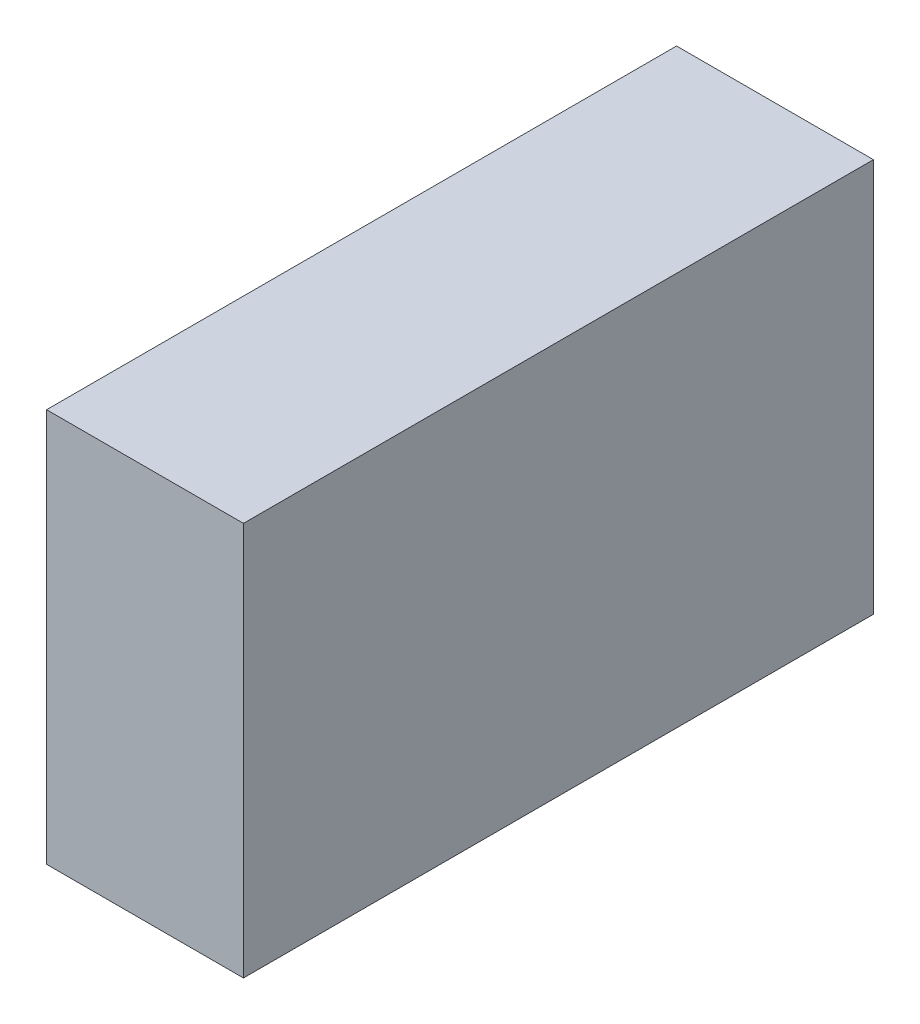
ISO-10303-21;
HEADER;
FILE_DESCRIPTION(('STEP AP214'),'2;1');
FILE_NAME('part.step','',(''),(''),'','','');
FILE_SCHEMA(('AUTOMOTIVE_DESIGN { 1 0 10303 214 1 1 1 1 }'));
ENDSEC;
DATA;
#1=APPLICATION_CONTEXT('core data for automotive mechanical design processes');
#2=APPLICATION_PROTOCOL_DEFINITION('international standard','automotive_design',2000,#1);
#3=PRODUCT_CONTEXT('',#1,'mechanical');
#4=PRODUCT('Part','Part','',(#3));
#5=PRODUCT_RELATED_PRODUCT_CATEGORY('part','',(#4));
#6=PRODUCT_DEFINITION_FORMATION('','',#4);
#7=PRODUCT_DEFINITION_CONTEXT('part definition',#1,'design');
#8=PRODUCT_DEFINITION('design','',#6,#7);
#9=PRODUCT_DEFINITION_SHAPE('','',#8);
#10=(LENGTH_UNIT() NAMED_UNIT(*) SI_UNIT(.MILLI.,.METRE.));
#11=(NAMED_UNIT(*) PLANE_ANGLE_UNIT() SI_UNIT($,.RADIAN.));
#12=(NAMED_UNIT(*) SI_UNIT($,.STERADIAN.) SOLID_ANGLE_UNIT());
#13=UNCERTAINTY_MEASURE_WITH_UNIT(LENGTH_MEASURE(1.E-05),#10,'distance_accuracy_value','');
#14=(GEOMETRIC_REPRESENTATION_CONTEXT(3) GLOBAL_UNCERTAINTY_ASSIGNED_CONTEXT((#13)) GLOBAL_UNIT_ASSIGNED_CONTEXT((#10,
#11,#12)) REPRESENTATION_CONTEXT('',''));
#15=CARTESIAN_POINT('',(0.,0.,0.));
#16=DIRECTION('',(0.,0.,1.));
#17=DIRECTION('',(1.,0.,0.));
#18=AXIS2_PLACEMENT_3D('',#15,#16,#17);
#19=CARTESIAN_POINT('',(-15.875,63.5,-101.6));
#20=DIRECTION('',(-1.,0.,0.));
#21=DIRECTION('',(0.,-1.,0.));
#22=AXIS2_PLACEMENT_3D('',#19,#20,#21);
#23=PLANE('',#22);
#24=DIRECTION('',(0.,-1.,0.));
#25=VECTOR('',#24,1.);
#26=CARTESIAN_POINT('',(-15.875,63.5,0.));
#27=LINE('',#26,#25);
#28=CARTESIAN_POINT('',(-15.875,63.5,0.));
#29=VERTEX_POINT('',#28);
#30=CARTESIAN_POINT('',(-15.875,0.,0.));
#31=VERTEX_POINT('',#30);
#32=EDGE_CURVE('E70',#29,#31,#27,.T.);
#33=ORIENTED_EDGE('',*,*,#32,.F.);
#34=DIRECTION('',(0.,0.,1.));
#35=VECTOR('',#34,1.);
#36=CARTESIAN_POINT('',(-15.875,63.5,-101.6));
#37=LINE('',#36,#35);
#38=CARTESIAN_POINT('',(-15.875,63.5,-101.6));
#39=VERTEX_POINT('',#38);
#40=EDGE_CURVE('E11',#39,#29,#37,.T.);
#41=ORIENTED_EDGE('',*,*,#40,.F.);
#42=DIRECTION('',(0.,-1.,0.));
#43=VECTOR('',#42,1.);
#44=CARTESIAN_POINT('',(-15.875,63.5,-101.6));
#45=LINE('',#44,#43);
#46=CARTESIAN_POINT('',(-15.875,0.,-101.6));
#47=VERTEX_POINT('',#46);
#48=EDGE_CURVE('E72',#39,#47,#45,.T.);
#49=ORIENTED_EDGE('',*,*,#48,.T.);
#50=DIRECTION('',(0.,0.,1.));
#51=VECTOR('',#50,1.);
#52=CARTESIAN_POINT('',(-15.875,0.,-101.6));
#53=LINE('',#52,#51);
#54=EDGE_CURVE('E33',#47,#31,#53,.T.);
#55=ORIENTED_EDGE('',*,*,#54,.T.);
#56=EDGE_LOOP('',(#33,#41,#49,#55));
#57=FACE_BOUND('',#56,.T.);
#58=ADVANCED_FACE('F30',(#57),#23,.T.);
#59=CARTESIAN_POINT('',(-15.875,63.5,-101.6));
#60=DIRECTION('',(0.,1.,0.));
#61=DIRECTION('',(0.,0.,1.));
#62=AXIS2_PLACEMENT_3D('',#59,#60,#61);
#63=PLANE('',#62);
#64=DIRECTION('',(-1.,0.,0.));
#65=VECTOR('',#64,1.);
#66=CARTESIAN_POINT('',(-15.875,63.5,0.));
#67=LINE('',#66,#65);
#68=CARTESIAN_POINT('',(15.875,63.5,0.));
#69=VERTEX_POINT('',#68);
#70=EDGE_CURVE('E87',#69,#29,#67,.T.);
#71=ORIENTED_EDGE('',*,*,#70,.F.);
#72=DIRECTION('',(0.,0.,1.));
#73=VECTOR('',#72,1.);
#74=CARTESIAN_POINT('',(15.875,63.5,-101.6));
#75=LINE('',#74,#73);
#76=CARTESIAN_POINT('',(15.875,63.5,-101.6));
#77=VERTEX_POINT('',#76);
#78=EDGE_CURVE('E38',#77,#69,#75,.T.);
#79=ORIENTED_EDGE('',*,*,#78,.F.);
#80=DIRECTION('',(-1.,0.,0.));
#81=VECTOR('',#80,1.);
#82=CARTESIAN_POINT('',(-15.875,63.5,-101.6));
#83=LINE('',#82,#81);
#84=EDGE_CURVE('E77',#77,#39,#83,.T.);
#85=ORIENTED_EDGE('',*,*,#84,.T.);
#86=ORIENTED_EDGE('',*,*,#40,.T.);
#87=EDGE_LOOP('',(#71,#79,#85,#86));
#88=FACE_BOUND('',#87,.T.);
#89=ADVANCED_FACE('F102',(#88),#63,.T.);
#90=CARTESIAN_POINT('',(15.875,63.5,-101.6));
#91=DIRECTION('',(1.,0.,0.));
#92=DIRECTION('',(0.,1.,0.));
#93=AXIS2_PLACEMENT_3D('',#90,#91,#92);
#94=PLANE('',#93);
#95=DIRECTION('',(0.,1.,0.));
#96=VECTOR('',#95,1.);
#97=CARTESIAN_POINT('',(15.875,63.5,0.));
#98=LINE('',#97,#96);
#99=CARTESIAN_POINT('',(15.875,0.,0.));
#100=VERTEX_POINT('',#99);
#101=EDGE_CURVE('E84',#100,#69,#98,.T.);
#102=ORIENTED_EDGE('',*,*,#101,.F.);
#103=DIRECTION('',(0.,0.,1.));
#104=VECTOR('',#103,1.);
#105=CARTESIAN_POINT('',(15.875,0.,-101.6));
#106=LINE('',#105,#104);
#107=CARTESIAN_POINT('',(15.875,0.,-101.6));
#108=VERTEX_POINT('',#107);
#109=EDGE_CURVE('E76',#108,#100,#106,.T.);
#110=ORIENTED_EDGE('',*,*,#109,.F.);
#111=DIRECTION('',(0.,1.,0.));
#112=VECTOR('',#111,1.);
#113=CARTESIAN_POINT('',(15.875,63.5,-101.6));
#114=LINE('',#113,#112);
#115=EDGE_CURVE('E95',#108,#77,#114,.T.);
#116=ORIENTED_EDGE('',*,*,#115,.T.);
#117=ORIENTED_EDGE('',*,*,#78,.T.);
#118=EDGE_LOOP('',(#102,#110,#116,#117));
#119=FACE_BOUND('',#118,.T.);
#120=ADVANCED_FACE('F99',(#119),#94,.T.);
#121=CARTESIAN_POINT('',(-15.875,0.,-101.6));
#122=DIRECTION('',(0.,-1.,0.));
#123=DIRECTION('',(0.,0.,-1.));
#124=AXIS2_PLACEMENT_3D('',#121,#122,#123);
#125=PLANE('',#124);
#126=DIRECTION('',(1.,0.,0.));
#127=VECTOR('',#126,1.);
#128=CARTESIAN_POINT('',(-15.875,0.,0.));
#129=LINE('',#128,#127);
#130=EDGE_CURVE('E79',#31,#100,#129,.T.);
#131=ORIENTED_EDGE('',*,*,#130,.F.);
#132=ORIENTED_EDGE('',*,*,#54,.F.);
#133=DIRECTION('',(1.,0.,0.));
#134=VECTOR('',#133,1.);
#135=CARTESIAN_POINT('',(-15.875,0.,-101.6));
#136=LINE('',#135,#134);
#137=EDGE_CURVE('E93',#47,#108,#136,.T.);
#138=ORIENTED_EDGE('',*,*,#137,.T.);
#139=ORIENTED_EDGE('',*,*,#109,.T.);
#140=EDGE_LOOP('',(#131,#132,#138,#139));
#141=FACE_BOUND('',#140,.T.);
#142=ADVANCED_FACE('F80',(#141),#125,.T.);
#143=CARTESIAN_POINT('',(-15.875,0.,-101.6));
#144=DIRECTION('',(0.,0.,1.));
#145=DIRECTION('',(1.,0.,0.));
#146=AXIS2_PLACEMENT_3D('',#143,#144,#145);
#147=PLANE('',#146);
#148=ORIENTED_EDGE('',*,*,#48,.F.);
#149=ORIENTED_EDGE('',*,*,#84,.F.);
#150=ORIENTED_EDGE('',*,*,#115,.F.);
#151=ORIENTED_EDGE('',*,*,#137,.F.);
#152=EDGE_LOOP('',(#148,#149,#150,#151));
#153=FACE_BOUND('',#152,.T.);
#154=ADVANCED_FACE('F104',(#153),#147,.F.);
#155=CARTESIAN_POINT('',(-15.875,0.,0.));
#156=DIRECTION('',(0.,0.,1.));
#157=DIRECTION('',(1.,0.,0.));
#158=AXIS2_PLACEMENT_3D('',#155,#156,#157);
#159=PLANE('',#158);
#160=ORIENTED_EDGE('',*,*,#32,.T.);
#161=ORIENTED_EDGE('',*,*,#130,.T.);
#162=ORIENTED_EDGE('',*,*,#101,.T.);
#163=ORIENTED_EDGE('',*,*,#70,.T.);
#164=EDGE_LOOP('',(#160,#161,#162,#163));
#165=FACE_BOUND('',#164,.T.);
#166=ADVANCED_FACE('F86',(#165),#159,.T.);
#167=CLOSED_SHELL('',(#58,#89,#120,#142,#154,#166));
#168=MANIFOLD_SOLID_BREP('B2',#167);
#169=ADVANCED_BREP_SHAPE_REPRESENTATION('',(#18,#168),#14);
#170=SHAPE_DEFINITION_REPRESENTATION(#9,#169);
ENDSEC;
END-ISO-10303-21;
